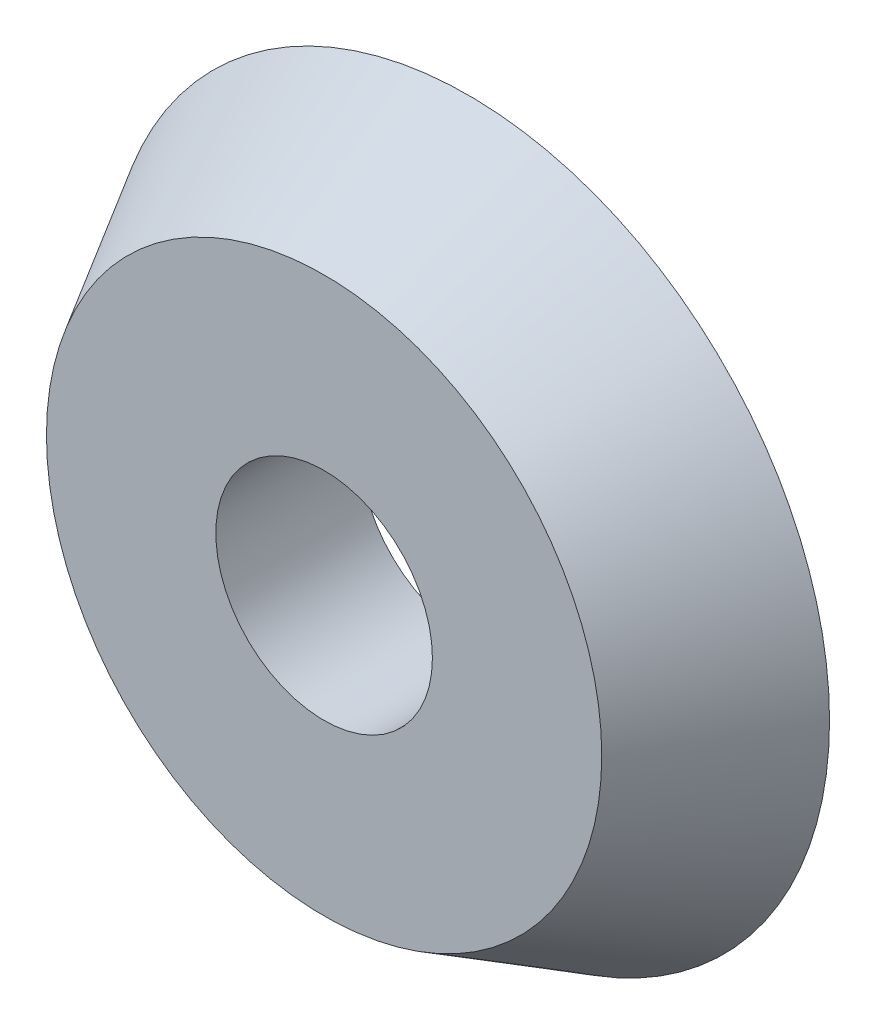
ISO-10303-21;
HEADER;
FILE_DESCRIPTION(('STEP AP214'),'2;1');
FILE_NAME('part.step','',(''),(''),'','','');
FILE_SCHEMA(('AUTOMOTIVE_DESIGN { 1 0 10303 214 1 1 1 1 }'));
ENDSEC;
DATA;
#1=APPLICATION_CONTEXT('core data for automotive mechanical design processes');
#2=APPLICATION_PROTOCOL_DEFINITION('international standard','automotive_design',2000,#1);
#3=PRODUCT_CONTEXT('',#1,'mechanical');
#4=PRODUCT('Part','Part','',(#3));
#5=PRODUCT_RELATED_PRODUCT_CATEGORY('part','',(#4));
#6=PRODUCT_DEFINITION_FORMATION('','',#4);
#7=PRODUCT_DEFINITION_CONTEXT('part definition',#1,'design');
#8=PRODUCT_DEFINITION('design','',#6,#7);
#9=PRODUCT_DEFINITION_SHAPE('','',#8);
#10=(LENGTH_UNIT() NAMED_UNIT(*) SI_UNIT(.MILLI.,.METRE.));
#11=(NAMED_UNIT(*) PLANE_ANGLE_UNIT() SI_UNIT($,.RADIAN.));
#12=(NAMED_UNIT(*) SI_UNIT($,.STERADIAN.) SOLID_ANGLE_UNIT());
#13=UNCERTAINTY_MEASURE_WITH_UNIT(LENGTH_MEASURE(1.E-05),#10,'distance_accuracy_value','');
#14=(GEOMETRIC_REPRESENTATION_CONTEXT(3) GLOBAL_UNCERTAINTY_ASSIGNED_CONTEXT((#13)) GLOBAL_UNIT_ASSIGNED_CONTEXT((#10,
#11,#12)) REPRESENTATION_CONTEXT('',''));
#15=CARTESIAN_POINT('',(0.,0.,0.));
#16=DIRECTION('',(0.,0.,1.));
#17=DIRECTION('',(1.,0.,0.));
#18=AXIS2_PLACEMENT_3D('',#15,#16,#17);
#19=CARTESIAN_POINT('',(0.,0.,0.));
#20=DIRECTION('',(0.,0.,-1.));
#21=DIRECTION('',(1.,0.,0.));
#22=AXIS2_PLACEMENT_3D('',#19,#20,#21);
#23=CONICAL_SURFACE('',#22,50.,0.5235987755983);
#24=CARTESIAN_POINT('',(0.,0.,20.));
#25=DIRECTION('',(0.,0.,1.));
#26=DIRECTION('',(1.,0.,0.));
#27=AXIS2_PLACEMENT_3D('',#24,#25,#26);
#28=CIRCLE('',#27,38.4529946162074);
#29=CARTESIAN_POINT('',(38.4529946162074,0.,20.));
#30=VERTEX_POINT('',#29);
#31=EDGE_CURVE('E10',#30,#30,#28,.T.);
#32=ORIENTED_EDGE('',*,*,#31,.F.);
#33=EDGE_LOOP('',(#32));
#34=FACE_BOUND('',#33,.T.);
#35=CARTESIAN_POINT('',(0.,0.,0.));
#36=DIRECTION('',(0.,0.,1.));
#37=DIRECTION('',(1.,0.,0.));
#38=AXIS2_PLACEMENT_3D('',#35,#36,#37);
#39=CIRCLE('',#38,50.);
#40=CARTESIAN_POINT('',(50.,0.,0.));
#41=VERTEX_POINT('',#40);
#42=EDGE_CURVE('E45',#41,#41,#39,.T.);
#43=ORIENTED_EDGE('',*,*,#42,.T.);
#44=EDGE_LOOP('',(#43));
#45=FACE_BOUND('',#44,.T.);
#46=ADVANCED_FACE('F39',(#34,#45),#23,.T.);
#47=CARTESIAN_POINT('',(0.,0.,20.));
#48=DIRECTION('',(0.,0.,1.));
#49=DIRECTION('',(1.,0.,0.));
#50=AXIS2_PLACEMENT_3D('',#47,#48,#49);
#51=PLANE('',#50);
#52=CARTESIAN_POINT('',(0.,0.,20.));
#53=DIRECTION('',(0.,0.,1.));
#54=DIRECTION('',(1.,0.,0.));
#55=AXIS2_PLACEMENT_3D('',#52,#53,#54);
#56=CIRCLE('',#55,15.);
#57=CARTESIAN_POINT('',(15.,0.,20.));
#58=VERTEX_POINT('',#57);
#59=EDGE_CURVE('E53',#58,#58,#56,.T.);
#60=ORIENTED_EDGE('',*,*,#59,.F.);
#61=EDGE_LOOP('',(#60));
#62=FACE_BOUND('',#61,.T.);
#63=ORIENTED_EDGE('',*,*,#31,.T.);
#64=EDGE_LOOP('',(#63));
#65=FACE_BOUND('',#64,.T.);
#66=ADVANCED_FACE('F61',(#62,#65),#51,.T.);
#67=CARTESIAN_POINT('',(0.,0.,0.));
#68=DIRECTION('',(0.,0.,1.));
#69=DIRECTION('',(1.,0.,0.));
#70=AXIS2_PLACEMENT_3D('',#67,#68,#69);
#71=PLANE('',#70);
#72=CARTESIAN_POINT('',(0.,0.,0.));
#73=DIRECTION('',(0.,0.,1.));
#74=DIRECTION('',(1.,0.,0.));
#75=AXIS2_PLACEMENT_3D('',#72,#73,#74);
#76=CIRCLE('',#75,15.);
#77=CARTESIAN_POINT('',(15.,0.,0.));
#78=VERTEX_POINT('',#77);
#79=EDGE_CURVE('E49',#78,#78,#76,.T.);
#80=ORIENTED_EDGE('',*,*,#79,.T.);
#81=EDGE_LOOP('',(#80));
#82=FACE_BOUND('',#81,.T.);
#83=ORIENTED_EDGE('',*,*,#42,.F.);
#84=EDGE_LOOP('',(#83));
#85=FACE_BOUND('',#84,.T.);
#86=ADVANCED_FACE('F63',(#82,#85),#71,.F.);
#87=CARTESIAN_POINT('',(0.,0.,0.));
#88=DIRECTION('',(0.,0.,1.));
#89=DIRECTION('',(1.,0.,0.));
#90=AXIS2_PLACEMENT_3D('',#87,#88,#89);
#91=CYLINDRICAL_SURFACE('',#90,15.);
#92=ORIENTED_EDGE('',*,*,#79,.F.);
#93=EDGE_LOOP('',(#92));
#94=FACE_BOUND('',#93,.T.);
#95=ORIENTED_EDGE('',*,*,#59,.T.);
#96=EDGE_LOOP('',(#95));
#97=FACE_BOUND('',#96,.T.);
#98=ADVANCED_FACE('F59',(#94,#97),#91,.F.);
#99=CLOSED_SHELL('',(#46,#66,#86,#98));
#100=MANIFOLD_SOLID_BREP('B2',#99);
#101=ADVANCED_BREP_SHAPE_REPRESENTATION('',(#18,#100),#14);
#102=SHAPE_DEFINITION_REPRESENTATION(#9,#101);
ENDSEC;
END-ISO-10303-21;
